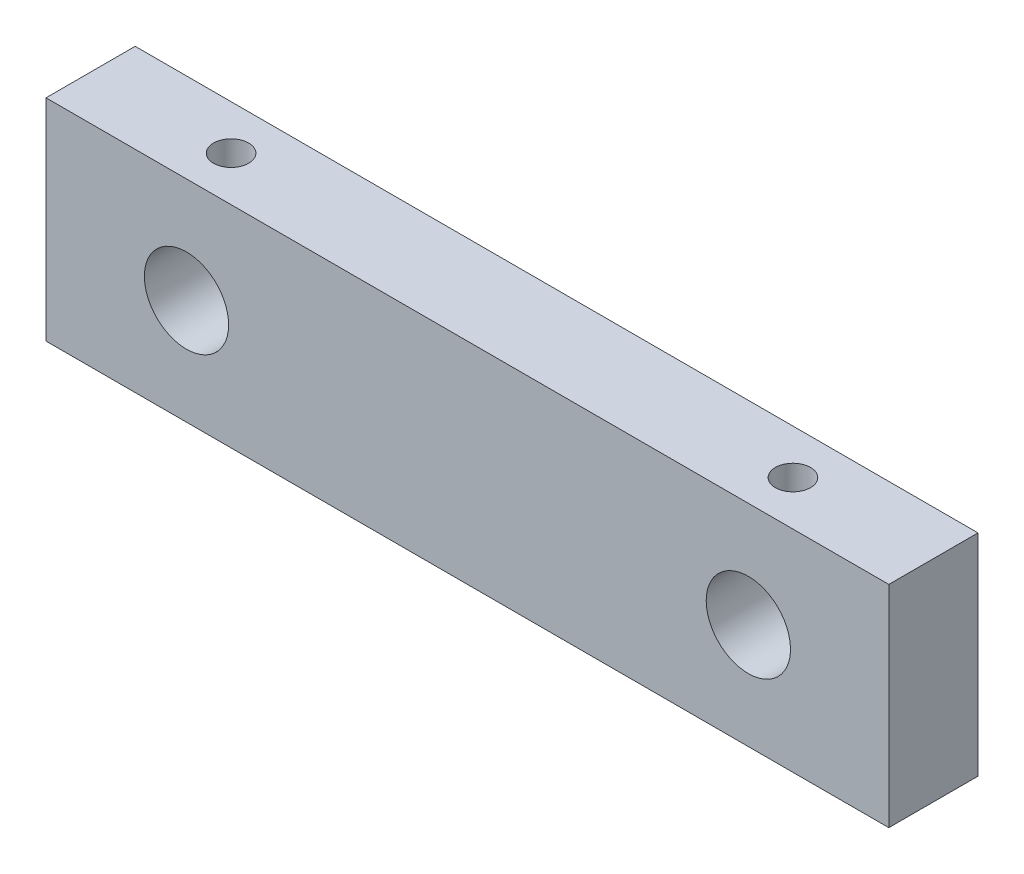
ISO-10303-21;
HEADER;
FILE_DESCRIPTION(('STEP AP214'),'2;1');
FILE_NAME('part.step','',(''),(''),'','','');
FILE_SCHEMA(('AUTOMOTIVE_DESIGN { 1 0 10303 214 1 1 1 1 }'));
ENDSEC;
DATA;
#1=APPLICATION_CONTEXT('core data for automotive mechanical design processes');
#2=APPLICATION_PROTOCOL_DEFINITION('international standard','automotive_design',2000,#1);
#3=PRODUCT_CONTEXT('',#1,'mechanical');
#4=PRODUCT('Part','Part','',(#3));
#5=PRODUCT_RELATED_PRODUCT_CATEGORY('part','',(#4));
#6=PRODUCT_DEFINITION_FORMATION('','',#4);
#7=PRODUCT_DEFINITION_CONTEXT('part definition',#1,'design');
#8=PRODUCT_DEFINITION('design','',#6,#7);
#9=PRODUCT_DEFINITION_SHAPE('','',#8);
#10=(LENGTH_UNIT() NAMED_UNIT(*) SI_UNIT(.MILLI.,.METRE.));
#11=(NAMED_UNIT(*) PLANE_ANGLE_UNIT() SI_UNIT($,.RADIAN.));
#12=(NAMED_UNIT(*) SI_UNIT($,.STERADIAN.) SOLID_ANGLE_UNIT());
#13=UNCERTAINTY_MEASURE_WITH_UNIT(LENGTH_MEASURE(1.E-05),#10,'distance_accuracy_value','');
#14=(GEOMETRIC_REPRESENTATION_CONTEXT(3) GLOBAL_UNCERTAINTY_ASSIGNED_CONTEXT((#13)) GLOBAL_UNIT_ASSIGNED_CONTEXT((#10,
#11,#12)) REPRESENTATION_CONTEXT('',''));
#15=CARTESIAN_POINT('',(0.,0.,0.));
#16=DIRECTION('',(0.,0.,1.));
#17=DIRECTION('',(1.,0.,0.));
#18=AXIS2_PLACEMENT_3D('',#15,#16,#17);
#19=CARTESIAN_POINT('',(0.,15.,6.35));
#20=DIRECTION('',(0.,0.,-1.));
#21=DIRECTION('',(-1.,0.,0.));
#22=AXIS2_PLACEMENT_3D('',#19,#20,#21);
#23=PLANE('',#22);
#24=CARTESIAN_POINT('',(10.,7.5,6.35));
#25=DIRECTION('',(0.,0.,1.));
#26=DIRECTION('',(1.,0.,0.));
#27=AXIS2_PLACEMENT_3D('',#24,#25,#26);
#28=CIRCLE('',#27,3.);
#29=CARTESIAN_POINT('',(13.,7.5,6.35));
#30=VERTEX_POINT('',#29);
#31=EDGE_CURVE('E107',#30,#30,#28,.T.);
#32=ORIENTED_EDGE('',*,*,#31,.F.);
#33=EDGE_LOOP('',(#32));
#34=FACE_BOUND('',#33,.T.);
#35=DIRECTION('',(0.,-1.,0.));
#36=VECTOR('',#35,1.);
#37=CARTESIAN_POINT('',(0.,0.,6.35));
#38=LINE('',#37,#36);
#39=CARTESIAN_POINT('',(0.,15.,6.35));
#40=VERTEX_POINT('',#39);
#41=CARTESIAN_POINT('',(0.,0.,6.35));
#42=VERTEX_POINT('',#41);
#43=EDGE_CURVE('E91',#40,#42,#38,.T.);
#44=ORIENTED_EDGE('',*,*,#43,.T.);
#45=DIRECTION('',(1.,0.,0.));
#46=VECTOR('',#45,1.);
#47=CARTESIAN_POINT('',(0.,0.,6.35));
#48=LINE('',#47,#46);
#49=CARTESIAN_POINT('',(60.,0.,6.35));
#50=VERTEX_POINT('',#49);
#51=EDGE_CURVE('E86',#42,#50,#48,.T.);
#52=ORIENTED_EDGE('',*,*,#51,.T.);
#53=DIRECTION('',(0.,1.,0.));
#54=VECTOR('',#53,1.);
#55=CARTESIAN_POINT('',(60.,0.,6.35));
#56=LINE('',#55,#54);
#57=CARTESIAN_POINT('',(60.,15.,6.35));
#58=VERTEX_POINT('',#57);
#59=EDGE_CURVE('E89',#50,#58,#56,.T.);
#60=ORIENTED_EDGE('',*,*,#59,.T.);
#61=DIRECTION('',(-1.,0.,0.));
#62=VECTOR('',#61,1.);
#63=CARTESIAN_POINT('',(0.,15.,6.35));
#64=LINE('',#63,#62);
#65=EDGE_CURVE('E56',#58,#40,#64,.T.);
#66=ORIENTED_EDGE('',*,*,#65,.T.);
#67=EDGE_LOOP('',(#44,#52,#60,#66));
#68=FACE_BOUND('',#67,.T.);
#69=CARTESIAN_POINT('',(50.,7.5,6.35));
#70=DIRECTION('',(0.,0.,1.));
#71=DIRECTION('',(-1.,0.,0.));
#72=AXIS2_PLACEMENT_3D('',#69,#70,#71);
#73=CIRCLE('',#72,3.00000000000001);
#74=CARTESIAN_POINT('',(47.,7.5,6.35));
#75=VERTEX_POINT('',#74);
#76=EDGE_CURVE('E165',#75,#75,#73,.T.);
#77=ORIENTED_EDGE('',*,*,#76,.F.);
#78=EDGE_LOOP('',(#77));
#79=FACE_BOUND('',#78,.T.);
#80=ADVANCED_FACE('F33',(#34,#68,#79),#23,.F.);
#81=CARTESIAN_POINT('',(0.,15.,0.));
#82=DIRECTION('',(0.,0.,-1.));
#83=DIRECTION('',(-1.,0.,0.));
#84=AXIS2_PLACEMENT_3D('',#81,#82,#83);
#85=PLANE('',#84);
#86=CARTESIAN_POINT('',(10.,7.5,0.));
#87=DIRECTION('',(0.,0.,1.));
#88=DIRECTION('',(1.,0.,0.));
#89=AXIS2_PLACEMENT_3D('',#86,#87,#88);
#90=CIRCLE('',#89,3.);
#91=CARTESIAN_POINT('',(13.,7.5,0.));
#92=VERTEX_POINT('',#91);
#93=EDGE_CURVE('E168',#92,#92,#90,.T.);
#94=ORIENTED_EDGE('',*,*,#93,.T.);
#95=EDGE_LOOP('',(#94));
#96=FACE_BOUND('',#95,.T.);
#97=DIRECTION('',(0.,-1.,0.));
#98=VECTOR('',#97,1.);
#99=CARTESIAN_POINT('',(0.,0.,0.));
#100=LINE('',#99,#98);
#101=CARTESIAN_POINT('',(0.,15.,0.));
#102=VERTEX_POINT('',#101);
#103=CARTESIAN_POINT('',(0.,0.,0.));
#104=VERTEX_POINT('',#103);
#105=EDGE_CURVE('E104',#102,#104,#100,.T.);
#106=ORIENTED_EDGE('',*,*,#105,.F.);
#107=DIRECTION('',(-1.,0.,0.));
#108=VECTOR('',#107,1.);
#109=CARTESIAN_POINT('',(0.,15.,0.));
#110=LINE('',#109,#108);
#111=CARTESIAN_POINT('',(60.,15.,0.));
#112=VERTEX_POINT('',#111);
#113=EDGE_CURVE('E79',#112,#102,#110,.T.);
#114=ORIENTED_EDGE('',*,*,#113,.F.);
#115=DIRECTION('',(0.,1.,0.));
#116=VECTOR('',#115,1.);
#117=CARTESIAN_POINT('',(60.,0.,0.));
#118=LINE('',#117,#116);
#119=CARTESIAN_POINT('',(60.,0.,0.));
#120=VERTEX_POINT('',#119);
#121=EDGE_CURVE('E73',#120,#112,#118,.T.);
#122=ORIENTED_EDGE('',*,*,#121,.F.);
#123=DIRECTION('',(1.,0.,0.));
#124=VECTOR('',#123,1.);
#125=CARTESIAN_POINT('',(0.,0.,0.));
#126=LINE('',#125,#124);
#127=EDGE_CURVE('E95',#104,#120,#126,.T.);
#128=ORIENTED_EDGE('',*,*,#127,.F.);
#129=EDGE_LOOP('',(#106,#114,#122,#128));
#130=FACE_BOUND('',#129,.T.);
#131=CARTESIAN_POINT('',(50.,7.5,0.));
#132=DIRECTION('',(0.,0.,1.));
#133=DIRECTION('',(-1.,0.,0.));
#134=AXIS2_PLACEMENT_3D('',#131,#132,#133);
#135=CIRCLE('',#134,3.00000000000001);
#136=CARTESIAN_POINT('',(47.,7.5,0.));
#137=VERTEX_POINT('',#136);
#138=EDGE_CURVE('E118',#137,#137,#135,.T.);
#139=ORIENTED_EDGE('',*,*,#138,.T.);
#140=EDGE_LOOP('',(#139));
#141=FACE_BOUND('',#140,.T.);
#142=ADVANCED_FACE('F135',(#96,#130,#141),#85,.T.);
#143=CARTESIAN_POINT('',(0.,0.,6.35));
#144=DIRECTION('',(1.,0.,0.));
#145=DIRECTION('',(0.,0.,-1.));
#146=AXIS2_PLACEMENT_3D('',#143,#144,#145);
#147=PLANE('',#146);
#148=ORIENTED_EDGE('',*,*,#105,.T.);
#149=DIRECTION('',(0.,0.,-1.));
#150=VECTOR('',#149,1.);
#151=CARTESIAN_POINT('',(0.,0.,6.35));
#152=LINE('',#151,#150);
#153=EDGE_CURVE('E11',#42,#104,#152,.T.);
#154=ORIENTED_EDGE('',*,*,#153,.F.);
#155=ORIENTED_EDGE('',*,*,#43,.F.);
#156=DIRECTION('',(0.,0.,-1.));
#157=VECTOR('',#156,1.);
#158=CARTESIAN_POINT('',(0.,15.,6.35));
#159=LINE('',#158,#157);
#160=EDGE_CURVE('E100',#40,#102,#159,.T.);
#161=ORIENTED_EDGE('',*,*,#160,.T.);
#162=EDGE_LOOP('',(#148,#154,#155,#161));
#163=FACE_BOUND('',#162,.T.);
#164=ADVANCED_FACE('F35',(#163),#147,.F.);
#165=CARTESIAN_POINT('',(0.,0.,6.35));
#166=DIRECTION('',(0.,1.,0.));
#167=DIRECTION('',(0.,0.,1.));
#168=AXIS2_PLACEMENT_3D('',#165,#166,#167);
#169=PLANE('',#168);
#170=ORIENTED_EDGE('',*,*,#127,.T.);
#171=DIRECTION('',(0.,0.,-1.));
#172=VECTOR('',#171,1.);
#173=CARTESIAN_POINT('',(60.,0.,6.35));
#174=LINE('',#173,#172);
#175=EDGE_CURVE('E47',#50,#120,#174,.T.);
#176=ORIENTED_EDGE('',*,*,#175,.F.);
#177=ORIENTED_EDGE('',*,*,#51,.F.);
#178=ORIENTED_EDGE('',*,*,#153,.T.);
#179=EDGE_LOOP('',(#170,#176,#177,#178));
#180=FACE_BOUND('',#179,.T.);
#181=ADVANCED_FACE('F94',(#180),#169,.F.);
#182=CARTESIAN_POINT('',(60.,0.,6.35));
#183=DIRECTION('',(-1.,0.,0.));
#184=DIRECTION('',(0.,0.,1.));
#185=AXIS2_PLACEMENT_3D('',#182,#183,#184);
#186=PLANE('',#185);
#187=ORIENTED_EDGE('',*,*,#121,.T.);
#188=DIRECTION('',(0.,0.,-1.));
#189=VECTOR('',#188,1.);
#190=CARTESIAN_POINT('',(60.,15.,6.35));
#191=LINE('',#190,#189);
#192=EDGE_CURVE('E96',#58,#112,#191,.T.);
#193=ORIENTED_EDGE('',*,*,#192,.F.);
#194=ORIENTED_EDGE('',*,*,#59,.F.);
#195=ORIENTED_EDGE('',*,*,#175,.T.);
#196=EDGE_LOOP('',(#187,#193,#194,#195));
#197=FACE_BOUND('',#196,.T.);
#198=ADVANCED_FACE('F98',(#197),#186,.F.);
#199=CARTESIAN_POINT('',(0.,15.,6.35));
#200=DIRECTION('',(0.,-1.,0.));
#201=DIRECTION('',(0.,0.,-1.));
#202=AXIS2_PLACEMENT_3D('',#199,#200,#201);
#203=PLANE('',#202);
#204=CARTESIAN_POINT('',(10.,15.,3.175));
#205=DIRECTION('',(0.,1.,0.));
#206=DIRECTION('',(0.,0.,1.));
#207=AXIS2_PLACEMENT_3D('',#204,#205,#206);
#208=CIRCLE('',#207,1.24999999999999);
#209=CARTESIAN_POINT('',(10.,15.,4.42499999999999));
#210=VERTEX_POINT('',#209);
#211=EDGE_CURVE('E185',#210,#210,#208,.T.);
#212=ORIENTED_EDGE('',*,*,#211,.F.);
#213=EDGE_LOOP('',(#212));
#214=FACE_BOUND('',#213,.T.);
#215=CARTESIAN_POINT('',(50.,15.,3.175));
#216=DIRECTION('',(0.,1.,0.));
#217=DIRECTION('',(0.,0.,1.));
#218=AXIS2_PLACEMENT_3D('',#215,#216,#217);
#219=CIRCLE('',#218,1.24999999999999);
#220=CARTESIAN_POINT('',(50.,15.,4.42499999999999));
#221=VERTEX_POINT('',#220);
#222=EDGE_CURVE('E119',#221,#221,#219,.T.);
#223=ORIENTED_EDGE('',*,*,#222,.F.);
#224=EDGE_LOOP('',(#223));
#225=FACE_BOUND('',#224,.T.);
#226=ORIENTED_EDGE('',*,*,#113,.T.);
#227=ORIENTED_EDGE('',*,*,#160,.F.);
#228=ORIENTED_EDGE('',*,*,#65,.F.);
#229=ORIENTED_EDGE('',*,*,#192,.T.);
#230=EDGE_LOOP('',(#226,#227,#228,#229));
#231=FACE_BOUND('',#230,.T.);
#232=ADVANCED_FACE('F147',(#214,#225,#231),#203,.F.);
#233=CARTESIAN_POINT('',(10.,7.5,6.35));
#234=DIRECTION('',(0.,0.,-1.));
#235=DIRECTION('',(-1.,0.,0.));
#236=AXIS2_PLACEMENT_3D('',#233,#234,#235);
#237=CYLINDRICAL_SURFACE('',#236,3.);
#238=CARTESIAN_POINT('',(10.,10.5,4.42499999999999));
#239=CARTESIAN_POINT('',(9.93304194736373,10.4999945836727,4.42499279490869));
#240=CARTESIAN_POINT('',(9.86597860293616,10.4977323297471,4.41958804147185));
#241=CARTESIAN_POINT('',(9.73375262884365,10.4889015357955,4.39816093507981));
#242=CARTESIAN_POINT('',(9.66859542357644,10.4823217590103,4.38211087553574));
#243=CARTESIAN_POINT('',(9.54231126634691,10.4655628903813,4.3400889082194));
#244=CARTESIAN_POINT('',(9.48117147557373,10.45539599975,4.31415061053184));
#245=CARTESIAN_POINT('',(9.3641702433202,10.4324528647066,4.25322717676742));
#246=CARTESIAN_POINT('',(9.30830720998406,10.4196774109285,4.21824478102912));
#247=CARTESIAN_POINT('',(9.20055159644049,10.3920782835187,4.13837101740911));
#248=CARTESIAN_POINT('',(9.14895873248224,10.3771875332609,4.09309869121024));
#249=CARTESIAN_POINT('',(9.05384017890874,10.3473271406851,3.99473566521742));
#250=CARTESIAN_POINT('',(9.01031873684692,10.3323574610681,3.94164087510548));
#251=CARTESIAN_POINT('',(8.93046262302935,10.30321021813,3.8259732224351));
#252=CARTESIAN_POINT('',(8.89458691846076,10.2891078687338,3.76306255157345));
#253=CARTESIAN_POINT('',(8.83406059411135,10.2643557235701,3.63142674207906));
#254=CARTESIAN_POINT('',(8.8094041916371,10.2537041500082,3.56270462051554));
#255=CARTESIAN_POINT('',(8.77325401687842,10.237785553877,3.42484630823207));
#256=CARTESIAN_POINT('',(8.76118342122395,10.2322838765179,3.35588951660784));
#257=CARTESIAN_POINT('',(8.74874790032205,10.226613262195,3.21672670731343));
#258=CARTESIAN_POINT('',(8.74837651945604,10.2264413842526,3.14652139997426));
#259=CARTESIAN_POINT('',(8.75891549636327,10.2312511956085,3.01259993956506));
#260=CARTESIAN_POINT('',(8.768963188877,10.2358388272362,2.94879890343554));
#261=CARTESIAN_POINT('',(8.79860808984224,10.248984827738,2.82388790899961));
#262=CARTESIAN_POINT('',(8.81820712712824,10.2575439570356,2.76277846850823));
#263=CARTESIAN_POINT('',(8.8667804127243,10.2778618477276,2.64344229700856));
#264=CARTESIAN_POINT('',(8.89594528460765,10.2896848194914,2.58530457908662));
#265=CARTESIAN_POINT('',(8.96268757419439,10.3151833114109,2.47452226611986));
#266=CARTESIAN_POINT('',(9.00026830948046,10.3288595612978,2.42187984938649));
#267=CARTESIAN_POINT('',(9.08650403445617,10.3579297687798,2.31890004126717));
#268=CARTESIAN_POINT('',(9.13582651679248,10.3733712140447,2.26913343261457));
#269=CARTESIAN_POINT('',(9.2422704089485,10.4032567311253,2.17838649704082));
#270=CARTESIAN_POINT('',(9.29939364055155,10.4177005687701,2.13740822830783));
#271=CARTESIAN_POINT('',(9.42155205130663,10.4443828355647,2.06456417638374));
#272=CARTESIAN_POINT('',(9.48673941755232,10.4565626654333,2.03293055484933));
#273=CARTESIAN_POINT('',(9.62214759747317,10.476894814148,1.98127886039675));
#274=CARTESIAN_POINT('',(9.69236560520497,10.485049358458,1.96125436805619));
#275=CARTESIAN_POINT('',(9.83107188665377,10.4959964118638,1.93458400787337));
#276=CARTESIAN_POINT('',(9.89938871472136,10.4990954104712,1.92717214255626));
#277=CARTESIAN_POINT('',(10.0363546554961,10.5005605036874,1.92365377638592));
#278=CARTESIAN_POINT('',(10.1050036671526,10.4989279571194,1.92754402974801));
#279=CARTESIAN_POINT('',(10.2370982423414,10.4913121765694,1.94597108480608));
#280=CARTESIAN_POINT('',(10.3006329666394,10.4855488728399,1.95996995409721));
#281=CARTESIAN_POINT('',(10.4243827489711,10.4704860677241,1.99746819454079));
#282=CARTESIAN_POINT('',(10.4845973865184,10.461186119597,2.02096876595031));
#283=CARTESIAN_POINT('',(10.6021089998691,10.4395827064517,2.07757097571213));
#284=CARTESIAN_POINT('',(10.6592572368553,10.4271949146928,2.11094818314604));
#285=CARTESIAN_POINT('',(10.7673462162314,10.4007380457909,2.1860533777917));
#286=CARTESIAN_POINT('',(10.8182843526019,10.3866682676873,2.22778485152928));
#287=CARTESIAN_POINT('',(10.9163334302743,10.3571208789544,2.32190323327242));
#288=CARTESIAN_POINT('',(10.9629106979798,10.3416145159103,2.37483850298627));
#289=CARTESIAN_POINT('',(11.0466698461055,10.3118433676801,2.4880212759354));
#290=CARTESIAN_POINT('',(11.0838495928562,10.2975788649344,2.54827043517174));
#291=CARTESIAN_POINT('',(11.148159602087,10.2718138624399,2.67561417530258));
#292=CARTESIAN_POINT('',(11.1751391823733,10.2603556255511,2.74279403551484));
#293=CARTESIAN_POINT('',(11.2171741395157,10.2420835565896,2.88137059381011));
#294=CARTESIAN_POINT('',(11.2322393486369,10.2352658955575,2.95276376248335));
#295=CARTESIAN_POINT('',(11.249040803489,10.2276316453726,3.09181869919921));
#296=CARTESIAN_POINT('',(11.2517138041313,10.2263935096716,3.15934466229262));
#297=CARTESIAN_POINT('',(11.2461557552391,10.2289385301102,3.2938428611411));
#298=CARTESIAN_POINT('',(11.2379263796472,10.2327209154031,3.36081518031369));
#299=CARTESIAN_POINT('',(11.2115840478049,10.2444955130227,3.48909274746889));
#300=CARTESIAN_POINT('',(11.1939490357146,10.2522835484648,3.55051667346339));
#301=CARTESIAN_POINT('',(11.1497632820213,10.2710318119919,3.66954802135722));
#302=CARTESIAN_POINT('',(11.1232100351725,10.2819929313169,3.72715436539878));
#303=CARTESIAN_POINT('',(11.0601028593549,10.3066695456001,3.84069589594912));
#304=CARTESIAN_POINT('',(11.0230436091048,10.3205110271368,3.89632233016829));
#305=CARTESIAN_POINT('',(10.9406840726304,10.3490368905384,4.00086013936068));
#306=CARTESIAN_POINT('',(10.8953809289056,10.3637215634587,4.04976917560057));
#307=CARTESIAN_POINT('',(10.7939020457788,10.3935639285011,4.14314868168474));
#308=CARTESIAN_POINT('',(10.737174739949,10.4086781751179,4.18703643284064));
#309=CARTESIAN_POINT('',(10.6166000792532,10.4366014362202,4.26469945354362));
#310=CARTESIAN_POINT('',(10.5527494979457,10.4494093991674,4.29847011488955));
#311=CARTESIAN_POINT('',(10.4207320567179,10.4710918336246,4.35420984543987));
#312=CARTESIAN_POINT('',(10.3526539909806,10.4800278258196,4.37636476661729));
#313=CARTESIAN_POINT('',(10.2134104218466,10.4932100976862,4.40870632907782));
#314=CARTESIAN_POINT('',(10.142255316981,10.4974710581197,4.41893044252987));
#315=CARTESIAN_POINT('',(10.0472360819192,10.4997228756893,4.42433316108643));
#316=CARTESIAN_POINT('',(10.0236245946757,10.5000019110254,4.42500254214921));
#317=CARTESIAN_POINT('',(10.,10.5,4.42499999999999));
#318=B_SPLINE_CURVE_WITH_KNOTS('',3,(#238,#239,#240,#241,#242,#243,#244,#245,#246,#247,#248,
#249,#250,#251,#252,#253,#254,#255,#256,#257,#258,#259,#260,#261,#262,#263,#264,#265,#266,#267,
#268,#269,#270,#271,#272,#273,#274,#275,#276,#277,#278,#279,#280,#281,#282,#283,#284,#285,#286,
#287,#288,#289,#290,#291,#292,#293,#294,#295,#296,#297,#298,#299,#300,#301,#302,#303,#304,#305,
#306,#307,#308,#309,#310,#311,#312,#313,#314,#315,#316,#317),.UNSPECIFIED.,.T.,.F.,(4,2,2,2,2,2,
2,2,2,2,2,2,2,2,2,2,2,2,2,2,2,2,2,2,2,2,2,2,2,2,2,2,2,2,2,2,2,2,2,4),(0.,0.200806918883936,
0.402138540628693,0.602791851906296,0.803384436852969,1.01317936288806,1.22308438131464,
1.44331724539124,1.66343646730586,1.87295273137556,2.08235338249044,2.27570157202555,
2.4690867972721,2.66658713058712,2.86416545717204,3.07844141127894,3.29276749314585,
3.5120405506081,3.73119224218294,3.93648443393248,4.14171767493168,4.33676589735718,
4.53183876601781,4.73297135272157,4.93418805469492,5.1497848802929,5.36543061240337,
5.58414788359519,5.80268447074576,6.00439877559639,6.20608211297531,6.39837649964757,
6.59072494950607,6.79463893397435,6.99862373425938,7.21746535004883,7.43640649428576,
7.65172855819379,7.86637250469315,7.93722256499091),.UNSPECIFIED.);
#319=CARTESIAN_POINT('',(10.,10.5,4.42499999999999));
#320=VERTEX_POINT('',#319);
#321=EDGE_CURVE('E37',#320,#320,#318,.T.);
#322=ORIENTED_EDGE('',*,*,#321,.F.);
#323=EDGE_LOOP('',(#322));
#324=FACE_BOUND('',#323,.T.);
#325=ORIENTED_EDGE('',*,*,#31,.T.);
#326=EDGE_LOOP('',(#325));
#327=FACE_BOUND('',#326,.T.);
#328=ORIENTED_EDGE('',*,*,#93,.F.);
#329=EDGE_LOOP('',(#328));
#330=FACE_BOUND('',#329,.T.);
#331=ADVANCED_FACE('F144',(#324,#327,#330),#237,.F.);
#332=CARTESIAN_POINT('',(50.,7.5,6.35));
#333=DIRECTION('',(0.,0.,-1.));
#334=DIRECTION('',(-1.,0.,0.));
#335=AXIS2_PLACEMENT_3D('',#332,#333,#334);
#336=CYLINDRICAL_SURFACE('',#335,3.00000000000001);
#337=CARTESIAN_POINT('',(50.,10.5,4.42499999999999));
#338=CARTESIAN_POINT('',(49.9330419473637,10.4999945836727,4.42499279490869));
#339=CARTESIAN_POINT('',(49.8659786029362,10.4977323297471,4.41958804147185));
#340=CARTESIAN_POINT('',(49.7337526288437,10.4889015357955,4.39816093507981));
#341=CARTESIAN_POINT('',(49.6685954235764,10.4823217590103,4.38211087553574));
#342=CARTESIAN_POINT('',(49.5423112663469,10.4655628903813,4.3400889082194));
#343=CARTESIAN_POINT('',(49.4811714755737,10.45539599975,4.31415061053184));
#344=CARTESIAN_POINT('',(49.3641702433202,10.4324528647066,4.25322717676742));
#345=CARTESIAN_POINT('',(49.3083072099841,10.4196774109285,4.21824478102912));
#346=CARTESIAN_POINT('',(49.2005515964405,10.3920782835187,4.13837101740911));
#347=CARTESIAN_POINT('',(49.1489587324822,10.3771875332609,4.09309869121023));
#348=CARTESIAN_POINT('',(49.0538401789087,10.3473271406851,3.99473566521742));
#349=CARTESIAN_POINT('',(49.0103187368469,10.3323574610681,3.94164087510548));
#350=CARTESIAN_POINT('',(48.9304626230294,10.30321021813,3.8259732224351));
#351=CARTESIAN_POINT('',(48.8945869184608,10.2891078687339,3.76306255157345));
#352=CARTESIAN_POINT('',(48.8340605941114,10.2643557235701,3.63142674207906));
#353=CARTESIAN_POINT('',(48.8094041916371,10.2537041500082,3.56270462051554));
#354=CARTESIAN_POINT('',(48.7732540168784,10.2377855538771,3.42484630823208));
#355=CARTESIAN_POINT('',(48.761183421224,10.2322838765179,3.35588951660785));
#356=CARTESIAN_POINT('',(48.7487479003221,10.2266132621951,3.21672670731343));
#357=CARTESIAN_POINT('',(48.748376519456,10.2264413842526,3.14652139997426));
#358=CARTESIAN_POINT('',(48.7589154963633,10.2312511956085,3.01259993956506));
#359=CARTESIAN_POINT('',(48.768963188877,10.2358388272362,2.94879890343554));
#360=CARTESIAN_POINT('',(48.7986080898422,10.248984827738,2.82388790899961));
#361=CARTESIAN_POINT('',(48.8182071271282,10.2575439570356,2.76277846850823));
#362=CARTESIAN_POINT('',(48.8667804127243,10.2778618477276,2.64344229700856));
#363=CARTESIAN_POINT('',(48.8959452846077,10.2896848194914,2.58530457908662));
#364=CARTESIAN_POINT('',(48.9626875741944,10.3151833114109,2.47452226611986));
#365=CARTESIAN_POINT('',(49.0002683094805,10.3288595612978,2.42187984938649));
#366=CARTESIAN_POINT('',(49.0865040344562,10.3579297687798,2.31890004126717));
#367=CARTESIAN_POINT('',(49.1358265167925,10.3733712140447,2.26913343261457));
#368=CARTESIAN_POINT('',(49.2422704089485,10.4032567311253,2.17838649704083));
#369=CARTESIAN_POINT('',(49.2993936405515,10.4177005687701,2.13740822830783));
#370=CARTESIAN_POINT('',(49.4215520513066,10.4443828355647,2.06456417638374));
#371=CARTESIAN_POINT('',(49.4867394175523,10.4565626654333,2.03293055484933));
#372=CARTESIAN_POINT('',(49.6221475974732,10.476894814148,1.98127886039675));
#373=CARTESIAN_POINT('',(49.692365605205,10.485049358458,1.96125436805619));
#374=CARTESIAN_POINT('',(49.8310718866538,10.4959964118639,1.93458400787337));
#375=CARTESIAN_POINT('',(49.8993887147214,10.4990954104713,1.92717214255626));
#376=CARTESIAN_POINT('',(50.0363546554961,10.5005605036875,1.92365377638592));
#377=CARTESIAN_POINT('',(50.1050036671526,10.4989279571194,1.92754402974801));
#378=CARTESIAN_POINT('',(50.2370982423414,10.4913121765694,1.94597108480608));
#379=CARTESIAN_POINT('',(50.3006329666394,10.4855488728399,1.95996995409721));
#380=CARTESIAN_POINT('',(50.4243827489711,10.4704860677242,1.99746819454079));
#381=CARTESIAN_POINT('',(50.4845973865184,10.461186119597,2.02096876595031));
#382=CARTESIAN_POINT('',(50.6021089998691,10.4395827064517,2.07757097571213));
#383=CARTESIAN_POINT('',(50.6592572368553,10.4271949146928,2.11094818314604));
#384=CARTESIAN_POINT('',(50.7673462162314,10.4007380457909,2.18605337779171));
#385=CARTESIAN_POINT('',(50.8182843526019,10.3866682676873,2.22778485152929));
#386=CARTESIAN_POINT('',(50.9163334302743,10.3571208789544,2.32190323327242));
#387=CARTESIAN_POINT('',(50.9629106979798,10.3416145159103,2.37483850298627));
#388=CARTESIAN_POINT('',(51.0466698461055,10.3118433676801,2.4880212759354));
#389=CARTESIAN_POINT('',(51.0838495928562,10.2975788649344,2.54827043517174));
#390=CARTESIAN_POINT('',(51.148159602087,10.2718138624399,2.67561417530258));
#391=CARTESIAN_POINT('',(51.1751391823733,10.2603556255511,2.74279403551484));
#392=CARTESIAN_POINT('',(51.2171741395157,10.2420835565896,2.88137059381011));
#393=CARTESIAN_POINT('',(51.2322393486369,10.2352658955575,2.95276376248335));
#394=CARTESIAN_POINT('',(51.249040803489,10.2276316453727,3.09181869919921));
#395=CARTESIAN_POINT('',(51.2517138041313,10.2263935096716,3.15934466229262));
#396=CARTESIAN_POINT('',(51.2461557552391,10.2289385301103,3.2938428611411));
#397=CARTESIAN_POINT('',(51.2379263796472,10.2327209154031,3.36081518031369));
#398=CARTESIAN_POINT('',(51.2115840478049,10.2444955130227,3.48909274746889));
#399=CARTESIAN_POINT('',(51.1939490357147,10.2522835484648,3.55051667346339));
#400=CARTESIAN_POINT('',(51.1497632820213,10.2710318119919,3.66954802135723));
#401=CARTESIAN_POINT('',(51.1232100351725,10.2819929313169,3.72715436539878));
#402=CARTESIAN_POINT('',(51.0601028593549,10.3066695456001,3.84069589594912));
#403=CARTESIAN_POINT('',(51.0230436091048,10.3205110271368,3.89632233016828));
#404=CARTESIAN_POINT('',(50.9406840726304,10.3490368905384,4.00086013936067));
#405=CARTESIAN_POINT('',(50.8953809289056,10.3637215634588,4.04976917560057));
#406=CARTESIAN_POINT('',(50.7939020457788,10.3935639285011,4.14314868168473));
#407=CARTESIAN_POINT('',(50.737174739949,10.4086781751179,4.18703643284064));
#408=CARTESIAN_POINT('',(50.6166000792532,10.4366014362202,4.26469945354361));
#409=CARTESIAN_POINT('',(50.5527494979457,10.4494093991674,4.29847011488954));
#410=CARTESIAN_POINT('',(50.4207320567179,10.4710918336246,4.35420984543987));
#411=CARTESIAN_POINT('',(50.3526539909806,10.4800278258196,4.37636476661729));
#412=CARTESIAN_POINT('',(50.2134104218466,10.4932100976863,4.40870632907782));
#413=CARTESIAN_POINT('',(50.142255316981,10.4974710581197,4.41893044252987));
#414=CARTESIAN_POINT('',(50.0472360819192,10.4997228756893,4.42433316108643));
#415=CARTESIAN_POINT('',(50.0236245946757,10.5000019110254,4.42500254214921));
#416=CARTESIAN_POINT('',(50.,10.5,4.42499999999999));
#417=B_SPLINE_CURVE_WITH_KNOTS('',3,(#337,#338,#339,#340,#341,#342,#343,#344,#345,#346,#347,
#348,#349,#350,#351,#352,#353,#354,#355,#356,#357,#358,#359,#360,#361,#362,#363,#364,#365,#366,
#367,#368,#369,#370,#371,#372,#373,#374,#375,#376,#377,#378,#379,#380,#381,#382,#383,#384,#385,
#386,#387,#388,#389,#390,#391,#392,#393,#394,#395,#396,#397,#398,#399,#400,#401,#402,#403,#404,
#405,#406,#407,#408,#409,#410,#411,#412,#413,#414,#415,#416),.UNSPECIFIED.,.T.,.F.,(4,2,2,2,2,2,
2,2,2,2,2,2,2,2,2,2,2,2,2,2,2,2,2,2,2,2,2,2,2,2,2,2,2,2,2,2,2,2,2,4),(0.,0.200806918883936,
0.402138540628691,0.602791851906306,0.803384436852966,1.01317936288806,1.22308438131465,
1.44331724539124,1.66343646730586,1.87295273137555,2.08235338249044,2.27570157202554,
2.4690867972721,2.66658713058712,2.86416545717204,3.07844141127894,3.29276749314585,
3.5120405506081,3.73119224218293,3.93648443393248,4.14171767493168,4.33676589735717,
4.5318387660178,4.73297135272156,4.93418805469491,5.14978488029289,5.36543061240336,
5.58414788359518,5.80268447074574,6.00439877559638,6.2060821129753,6.39837649964756,
6.59072494950606,6.79463893397434,6.99862373425937,7.21746535004882,7.43640649428575,
7.65172855819378,7.86637250469314,7.9372225649909),.UNSPECIFIED.);
#418=CARTESIAN_POINT('',(50.,10.5,4.42499999999999));
#419=VERTEX_POINT('',#418);
#420=EDGE_CURVE('E112',#419,#419,#417,.T.);
#421=ORIENTED_EDGE('',*,*,#420,.F.);
#422=EDGE_LOOP('',(#421));
#423=FACE_BOUND('',#422,.T.);
#424=ORIENTED_EDGE('',*,*,#76,.T.);
#425=EDGE_LOOP('',(#424));
#426=FACE_BOUND('',#425,.T.);
#427=ORIENTED_EDGE('',*,*,#138,.F.);
#428=EDGE_LOOP('',(#427));
#429=FACE_BOUND('',#428,.T.);
#430=ADVANCED_FACE('F120',(#423,#426,#429),#336,.F.);
#431=CARTESIAN_POINT('',(50.,15.,3.175));
#432=DIRECTION('',(0.,1.,0.));
#433=DIRECTION('',(0.,0.,1.));
#434=AXIS2_PLACEMENT_3D('',#431,#432,#433);
#435=CYLINDRICAL_SURFACE('',#434,1.24999999999999);
#436=ORIENTED_EDGE('',*,*,#420,.T.);
#437=EDGE_LOOP('',(#436));
#438=FACE_BOUND('',#437,.T.);
#439=ORIENTED_EDGE('',*,*,#222,.T.);
#440=EDGE_LOOP('',(#439));
#441=FACE_BOUND('',#440,.T.);
#442=ADVANCED_FACE('F122',(#438,#441),#435,.F.);
#443=CARTESIAN_POINT('',(10.,15.,3.175));
#444=DIRECTION('',(0.,1.,0.));
#445=DIRECTION('',(0.,0.,1.));
#446=AXIS2_PLACEMENT_3D('',#443,#444,#445);
#447=CYLINDRICAL_SURFACE('',#446,1.24999999999999);
#448=ORIENTED_EDGE('',*,*,#321,.T.);
#449=EDGE_LOOP('',(#448));
#450=FACE_BOUND('',#449,.T.);
#451=ORIENTED_EDGE('',*,*,#211,.T.);
#452=EDGE_LOOP('',(#451));
#453=FACE_BOUND('',#452,.T.);
#454=ADVANCED_FACE('F125',(#450,#453),#447,.F.);
#455=CLOSED_SHELL('',(#80,#142,#164,#181,#198,#232,#331,#430,#442,#454));
#456=MANIFOLD_SOLID_BREP('B2',#455);
#457=ADVANCED_BREP_SHAPE_REPRESENTATION('',(#18,#456),#14);
#458=SHAPE_DEFINITION_REPRESENTATION(#9,#457);
ENDSEC;
END-ISO-10303-21;
